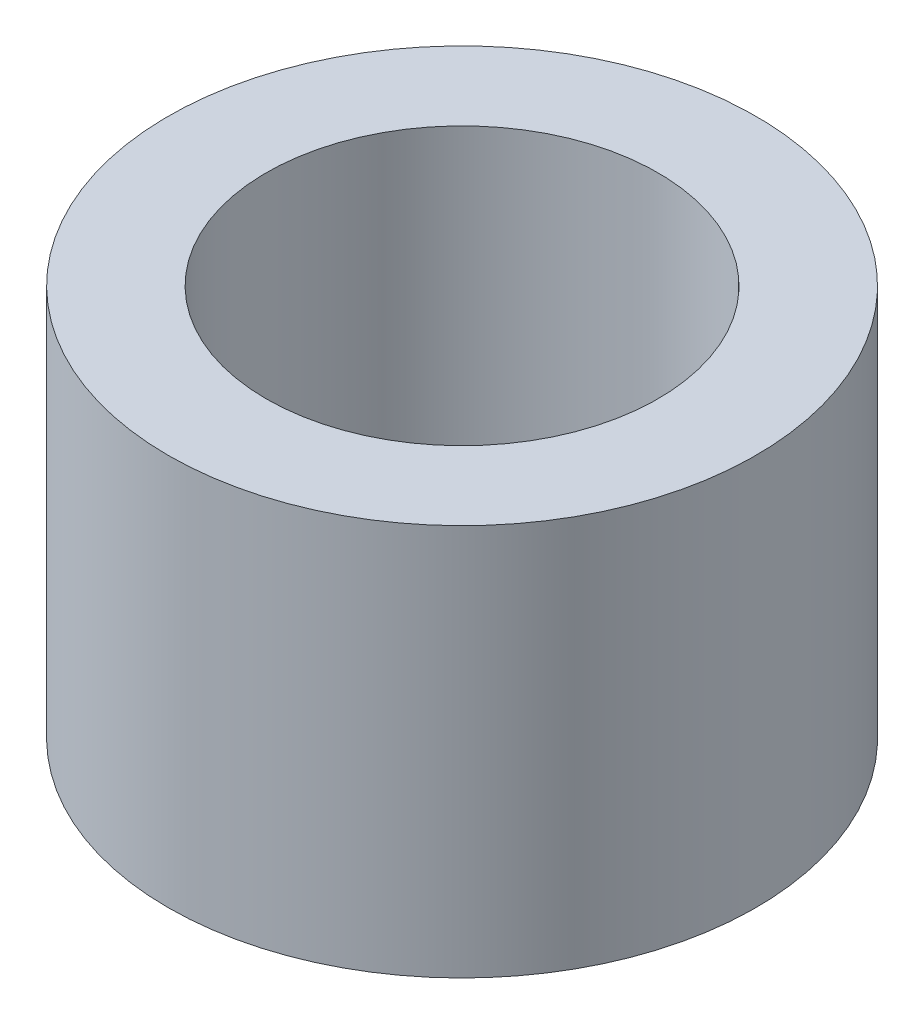
ISO-10303-21;
HEADER;
FILE_DESCRIPTION(('STEP AP214'),'2;1');
FILE_NAME('part.step','',(''),(''),'','','');
FILE_SCHEMA(('AUTOMOTIVE_DESIGN { 1 0 10303 214 1 1 1 1 }'));
ENDSEC;
DATA;
#1=APPLICATION_CONTEXT('core data for automotive mechanical design processes');
#2=APPLICATION_PROTOCOL_DEFINITION('international standard','automotive_design',2000,#1);
#3=PRODUCT_CONTEXT('',#1,'mechanical');
#4=PRODUCT('Part','Part','',(#3));
#5=PRODUCT_RELATED_PRODUCT_CATEGORY('part','',(#4));
#6=PRODUCT_DEFINITION_FORMATION('','',#4);
#7=PRODUCT_DEFINITION_CONTEXT('part definition',#1,'design');
#8=PRODUCT_DEFINITION('design','',#6,#7);
#9=PRODUCT_DEFINITION_SHAPE('','',#8);
#10=(LENGTH_UNIT() NAMED_UNIT(*) SI_UNIT(.MILLI.,.METRE.));
#11=(NAMED_UNIT(*) PLANE_ANGLE_UNIT() SI_UNIT($,.RADIAN.));
#12=(NAMED_UNIT(*) SI_UNIT($,.STERADIAN.) SOLID_ANGLE_UNIT());
#13=UNCERTAINTY_MEASURE_WITH_UNIT(LENGTH_MEASURE(1.E-05),#10,'distance_accuracy_value','');
#14=(GEOMETRIC_REPRESENTATION_CONTEXT(3) GLOBAL_UNCERTAINTY_ASSIGNED_CONTEXT((#13)) GLOBAL_UNIT_ASSIGNED_CONTEXT((#10,
#11,#12)) REPRESENTATION_CONTEXT('',''));
#15=CARTESIAN_POINT('',(0.,0.,0.));
#16=DIRECTION('',(0.,0.,1.));
#17=DIRECTION('',(1.,0.,0.));
#18=AXIS2_PLACEMENT_3D('',#15,#16,#17);
#19=CARTESIAN_POINT('',(0.,10.,0.));
#20=DIRECTION('',(0.,-1.,0.));
#21=DIRECTION('',(0.,0.,-1.));
#22=AXIS2_PLACEMENT_3D('',#19,#20,#21);
#23=CYLINDRICAL_SURFACE('',#22,7.5);
#24=CARTESIAN_POINT('',(0.,10.,0.));
#25=DIRECTION('',(0.,1.,0.));
#26=DIRECTION('',(0.,0.,1.));
#27=AXIS2_PLACEMENT_3D('',#24,#25,#26);
#28=CIRCLE('',#27,7.5);
#29=CARTESIAN_POINT('',(0.,10.,7.5));
#30=VERTEX_POINT('',#29);
#31=EDGE_CURVE('E10',#30,#30,#28,.T.);
#32=ORIENTED_EDGE('',*,*,#31,.F.);
#33=EDGE_LOOP('',(#32));
#34=FACE_BOUND('',#33,.T.);
#35=CARTESIAN_POINT('',(0.,0.,0.));
#36=DIRECTION('',(0.,1.,0.));
#37=DIRECTION('',(0.,0.,1.));
#38=AXIS2_PLACEMENT_3D('',#35,#36,#37);
#39=CIRCLE('',#38,7.5);
#40=CARTESIAN_POINT('',(0.,0.,7.5));
#41=VERTEX_POINT('',#40);
#42=EDGE_CURVE('E40',#41,#41,#39,.T.);
#43=ORIENTED_EDGE('',*,*,#42,.T.);
#44=EDGE_LOOP('',(#43));
#45=FACE_BOUND('',#44,.T.);
#46=ADVANCED_FACE('F37',(#34,#45),#23,.T.);
#47=CARTESIAN_POINT('',(0.,10.,0.));
#48=DIRECTION('',(0.,1.,0.));
#49=DIRECTION('',(0.,0.,1.));
#50=AXIS2_PLACEMENT_3D('',#47,#48,#49);
#51=PLANE('',#50);
#52=CARTESIAN_POINT('',(0.,10.,0.));
#53=DIRECTION('',(0.,1.,0.));
#54=DIRECTION('',(0.,0.,1.));
#55=AXIS2_PLACEMENT_3D('',#52,#53,#54);
#56=CIRCLE('',#55,5.);
#57=CARTESIAN_POINT('',(0.,10.,5.));
#58=VERTEX_POINT('',#57);
#59=EDGE_CURVE('E51',#58,#58,#56,.T.);
#60=ORIENTED_EDGE('',*,*,#59,.F.);
#61=EDGE_LOOP('',(#60));
#62=FACE_BOUND('',#61,.T.);
#63=ORIENTED_EDGE('',*,*,#31,.T.);
#64=EDGE_LOOP('',(#63));
#65=FACE_BOUND('',#64,.T.);
#66=ADVANCED_FACE('F68',(#62,#65),#51,.T.);
#67=CARTESIAN_POINT('',(0.,0.,0.));
#68=DIRECTION('',(0.,1.,0.));
#69=DIRECTION('',(0.,0.,1.));
#70=AXIS2_PLACEMENT_3D('',#67,#68,#69);
#71=PLANE('',#70);
#72=CARTESIAN_POINT('',(0.,0.,0.));
#73=DIRECTION('',(0.,1.,0.));
#74=DIRECTION('',(0.,0.,1.));
#75=AXIS2_PLACEMENT_3D('',#72,#73,#74);
#76=CIRCLE('',#75,5.);
#77=CARTESIAN_POINT('',(0.,0.,5.));
#78=VERTEX_POINT('',#77);
#79=EDGE_CURVE('E49',#78,#78,#76,.T.);
#80=ORIENTED_EDGE('',*,*,#79,.T.);
#81=EDGE_LOOP('',(#80));
#82=FACE_BOUND('',#81,.T.);
#83=ORIENTED_EDGE('',*,*,#42,.F.);
#84=EDGE_LOOP('',(#83));
#85=FACE_BOUND('',#84,.T.);
#86=ADVANCED_FACE('F59',(#82,#85),#71,.F.);
#87=CARTESIAN_POINT('',(0.,0.,0.));
#88=DIRECTION('',(0.,1.,0.));
#89=DIRECTION('',(0.,0.,1.));
#90=AXIS2_PLACEMENT_3D('',#87,#88,#89);
#91=CYLINDRICAL_SURFACE('',#90,5.);
#92=ORIENTED_EDGE('',*,*,#79,.F.);
#93=EDGE_LOOP('',(#92));
#94=FACE_BOUND('',#93,.T.);
#95=ORIENTED_EDGE('',*,*,#59,.T.);
#96=EDGE_LOOP('',(#95));
#97=FACE_BOUND('',#96,.T.);
#98=ADVANCED_FACE('F62',(#94,#97),#91,.F.);
#99=CLOSED_SHELL('',(#46,#66,#86,#98));
#100=MANIFOLD_SOLID_BREP('B2',#99);
#101=ADVANCED_BREP_SHAPE_REPRESENTATION('',(#18,#100),#14);
#102=SHAPE_DEFINITION_REPRESENTATION(#9,#101);
ENDSEC;
END-ISO-10303-21;
